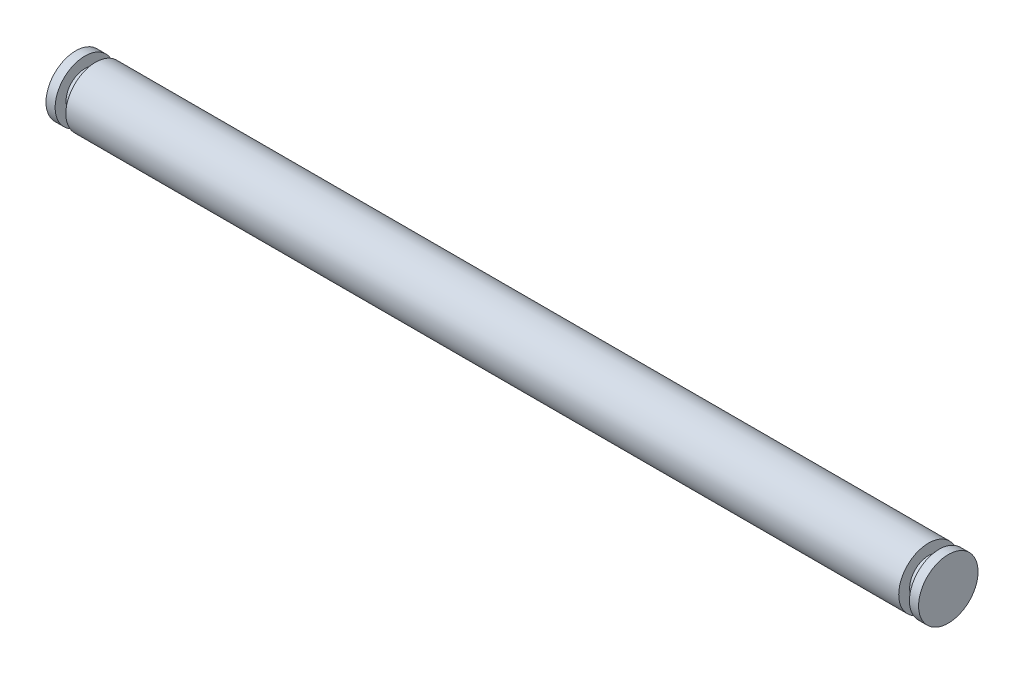
ISO-10303-21;
HEADER;
FILE_DESCRIPTION(('STEP AP214'),'2;1');
FILE_NAME('part.step','',(''),(''),'','','');
FILE_SCHEMA(('AUTOMOTIVE_DESIGN { 1 0 10303 214 1 1 1 1 }'));
ENDSEC;
DATA;
#1=APPLICATION_CONTEXT('core data for automotive mechanical design processes');
#2=APPLICATION_PROTOCOL_DEFINITION('international standard','automotive_design',2000,#1);
#3=PRODUCT_CONTEXT('',#1,'mechanical');
#4=PRODUCT('Part','Part','',(#3));
#5=PRODUCT_RELATED_PRODUCT_CATEGORY('part','',(#4));
#6=PRODUCT_DEFINITION_FORMATION('','',#4);
#7=PRODUCT_DEFINITION_CONTEXT('part definition',#1,'design');
#8=PRODUCT_DEFINITION('design','',#6,#7);
#9=PRODUCT_DEFINITION_SHAPE('','',#8);
#10=(LENGTH_UNIT() NAMED_UNIT(*) SI_UNIT(.MILLI.,.METRE.));
#11=(NAMED_UNIT(*) PLANE_ANGLE_UNIT() SI_UNIT($,.RADIAN.));
#12=(NAMED_UNIT(*) SI_UNIT($,.STERADIAN.) SOLID_ANGLE_UNIT());
#13=UNCERTAINTY_MEASURE_WITH_UNIT(LENGTH_MEASURE(1.E-05),#10,'distance_accuracy_value','');
#14=(GEOMETRIC_REPRESENTATION_CONTEXT(3) GLOBAL_UNCERTAINTY_ASSIGNED_CONTEXT((#13)) GLOBAL_UNIT_ASSIGNED_CONTEXT((#10,
#11,#12)) REPRESENTATION_CONTEXT('',''));
#15=CARTESIAN_POINT('',(0.,0.,0.));
#16=DIRECTION('',(0.,0.,1.));
#17=DIRECTION('',(1.,0.,0.));
#18=AXIS2_PLACEMENT_3D('',#15,#16,#17);
#19=CARTESIAN_POINT('',(22.,0.,0.));
#20=DIRECTION('',(-1.,0.,0.));
#21=DIRECTION('',(0.,0.,1.));
#22=AXIS2_PLACEMENT_3D('',#19,#20,#21);
#23=CYLINDRICAL_SURFACE('',#22,1.5);
#24=CARTESIAN_POINT('',(22.,0.,0.));
#25=DIRECTION('',(-1.,0.,0.));
#26=DIRECTION('',(0.,0.,1.));
#27=AXIS2_PLACEMENT_3D('',#24,#25,#26);
#28=CIRCLE('',#27,1.5);
#29=CARTESIAN_POINT('',(22.,0.,1.5));
#30=VERTEX_POINT('',#29);
#31=EDGE_CURVE('E10',#30,#30,#28,.T.);
#32=ORIENTED_EDGE('',*,*,#31,.T.);
#33=EDGE_LOOP('',(#32));
#34=FACE_BOUND('',#33,.T.);
#35=CARTESIAN_POINT('',(21.54,0.,0.));
#36=DIRECTION('',(-1.,0.,0.));
#37=DIRECTION('',(0.,0.,1.));
#38=AXIS2_PLACEMENT_3D('',#35,#36,#37);
#39=CIRCLE('',#38,1.5);
#40=CARTESIAN_POINT('',(21.54,0.,1.5));
#41=VERTEX_POINT('',#40);
#42=EDGE_CURVE('E69',#41,#41,#39,.T.);
#43=ORIENTED_EDGE('',*,*,#42,.F.);
#44=EDGE_LOOP('',(#43));
#45=FACE_BOUND('',#44,.T.);
#46=ADVANCED_FACE('F35',(#34,#45),#23,.T.);
#47=CARTESIAN_POINT('',(22.,1.5,0.));
#48=DIRECTION('',(1.,0.,0.));
#49=DIRECTION('',(0.,0.,-1.));
#50=AXIS2_PLACEMENT_3D('',#47,#48,#49);
#51=PLANE('',#50);
#52=ORIENTED_EDGE('',*,*,#31,.F.);
#53=EDGE_LOOP('',(#52));
#54=FACE_BOUND('',#53,.T.);
#55=ADVANCED_FACE('F77',(#54),#51,.T.);
#56=CARTESIAN_POINT('',(-22.,0.,0.));
#57=DIRECTION('',(-1.,0.,0.));
#58=DIRECTION('',(0.,0.,1.));
#59=AXIS2_PLACEMENT_3D('',#56,#57,#58);
#60=PLANE('',#59);
#61=CARTESIAN_POINT('',(-22.,0.,0.));
#62=DIRECTION('',(-1.,0.,0.));
#63=DIRECTION('',(0.,0.,1.));
#64=AXIS2_PLACEMENT_3D('',#61,#62,#63);
#65=CIRCLE('',#64,1.5);
#66=CARTESIAN_POINT('',(-22.,0.,1.5));
#67=VERTEX_POINT('',#66);
#68=EDGE_CURVE('E41',#67,#67,#65,.T.);
#69=ORIENTED_EDGE('',*,*,#68,.T.);
#70=EDGE_LOOP('',(#69));
#71=FACE_BOUND('',#70,.T.);
#72=ADVANCED_FACE('F81',(#71),#60,.T.);
#73=CARTESIAN_POINT('',(22.,0.,0.));
#74=DIRECTION('',(-1.,0.,0.));
#75=DIRECTION('',(0.,0.,1.));
#76=AXIS2_PLACEMENT_3D('',#73,#74,#75);
#77=CYLINDRICAL_SURFACE('',#76,1.5);
#78=CARTESIAN_POINT('',(-21.54,0.,0.));
#79=DIRECTION('',(-1.,0.,0.));
#80=DIRECTION('',(0.,0.,1.));
#81=AXIS2_PLACEMENT_3D('',#78,#79,#80);
#82=CIRCLE('',#81,1.5);
#83=CARTESIAN_POINT('',(-21.54,0.,1.5));
#84=VERTEX_POINT('',#83);
#85=EDGE_CURVE('E45',#84,#84,#82,.T.);
#86=ORIENTED_EDGE('',*,*,#85,.T.);
#87=EDGE_LOOP('',(#86));
#88=FACE_BOUND('',#87,.T.);
#89=ORIENTED_EDGE('',*,*,#68,.F.);
#90=EDGE_LOOP('',(#89));
#91=FACE_BOUND('',#90,.T.);
#92=ADVANCED_FACE('F86',(#88,#91),#77,.T.);
#93=CARTESIAN_POINT('',(-21.54,1.5,0.));
#94=DIRECTION('',(1.,0.,0.));
#95=DIRECTION('',(0.,0.,-1.));
#96=AXIS2_PLACEMENT_3D('',#93,#94,#95);
#97=PLANE('',#96);
#98=CARTESIAN_POINT('',(-21.54,0.,0.));
#99=DIRECTION('',(-1.,0.,0.));
#100=DIRECTION('',(0.,0.,1.));
#101=AXIS2_PLACEMENT_3D('',#98,#99,#100);
#102=CIRCLE('',#101,0.95);
#103=CARTESIAN_POINT('',(-21.54,0.,0.95));
#104=VERTEX_POINT('',#103);
#105=EDGE_CURVE('E49',#104,#104,#102,.T.);
#106=ORIENTED_EDGE('',*,*,#105,.T.);
#107=EDGE_LOOP('',(#106));
#108=FACE_BOUND('',#107,.T.);
#109=ORIENTED_EDGE('',*,*,#85,.F.);
#110=EDGE_LOOP('',(#109));
#111=FACE_BOUND('',#110,.T.);
#112=ADVANCED_FACE('F91',(#108,#111),#97,.T.);
#113=CARTESIAN_POINT('',(22.,0.,0.));
#114=DIRECTION('',(-1.,0.,0.));
#115=DIRECTION('',(0.,0.,1.));
#116=AXIS2_PLACEMENT_3D('',#113,#114,#115);
#117=CYLINDRICAL_SURFACE('',#116,0.95);
#118=CARTESIAN_POINT('',(-21.,0.,0.));
#119=DIRECTION('',(-1.,0.,0.));
#120=DIRECTION('',(0.,0.,1.));
#121=AXIS2_PLACEMENT_3D('',#118,#119,#120);
#122=CIRCLE('',#121,0.95);
#123=CARTESIAN_POINT('',(-21.,0.,0.95));
#124=VERTEX_POINT('',#123);
#125=EDGE_CURVE('E54',#124,#124,#122,.T.);
#126=ORIENTED_EDGE('',*,*,#125,.T.);
#127=EDGE_LOOP('',(#126));
#128=FACE_BOUND('',#127,.T.);
#129=ORIENTED_EDGE('',*,*,#105,.F.);
#130=EDGE_LOOP('',(#129));
#131=FACE_BOUND('',#130,.T.);
#132=ADVANCED_FACE('F95',(#128,#131),#117,.T.);
#133=CARTESIAN_POINT('',(-21.,0.95,0.));
#134=DIRECTION('',(-1.,0.,0.));
#135=DIRECTION('',(0.,0.,1.));
#136=AXIS2_PLACEMENT_3D('',#133,#134,#135);
#137=PLANE('',#136);
#138=CARTESIAN_POINT('',(-21.,0.,0.));
#139=DIRECTION('',(-1.,0.,0.));
#140=DIRECTION('',(0.,0.,1.));
#141=AXIS2_PLACEMENT_3D('',#138,#139,#140);
#142=CIRCLE('',#141,1.5);
#143=CARTESIAN_POINT('',(-21.,0.,1.5));
#144=VERTEX_POINT('',#143);
#145=EDGE_CURVE('E57',#144,#144,#142,.T.);
#146=ORIENTED_EDGE('',*,*,#145,.T.);
#147=EDGE_LOOP('',(#146));
#148=FACE_BOUND('',#147,.T.);
#149=ORIENTED_EDGE('',*,*,#125,.F.);
#150=EDGE_LOOP('',(#149));
#151=FACE_BOUND('',#150,.T.);
#152=ADVANCED_FACE('F99',(#148,#151),#137,.T.);
#153=CARTESIAN_POINT('',(22.,0.,0.));
#154=DIRECTION('',(-1.,0.,0.));
#155=DIRECTION('',(0.,0.,1.));
#156=AXIS2_PLACEMENT_3D('',#153,#154,#155);
#157=CYLINDRICAL_SURFACE('',#156,1.5);
#158=CARTESIAN_POINT('',(21.,0.,0.));
#159=DIRECTION('',(-1.,0.,0.));
#160=DIRECTION('',(0.,0.,1.));
#161=AXIS2_PLACEMENT_3D('',#158,#159,#160);
#162=CIRCLE('',#161,1.5);
#163=CARTESIAN_POINT('',(21.,0.,1.5));
#164=VERTEX_POINT('',#163);
#165=EDGE_CURVE('E60',#164,#164,#162,.T.);
#166=ORIENTED_EDGE('',*,*,#165,.T.);
#167=EDGE_LOOP('',(#166));
#168=FACE_BOUND('',#167,.T.);
#169=ORIENTED_EDGE('',*,*,#145,.F.);
#170=EDGE_LOOP('',(#169));
#171=FACE_BOUND('',#170,.T.);
#172=ADVANCED_FACE('F103',(#168,#171),#157,.T.);
#173=CARTESIAN_POINT('',(21.,1.5,0.));
#174=DIRECTION('',(1.,0.,0.));
#175=DIRECTION('',(0.,0.,-1.));
#176=AXIS2_PLACEMENT_3D('',#173,#174,#175);
#177=PLANE('',#176);
#178=CARTESIAN_POINT('',(21.,0.,0.));
#179=DIRECTION('',(-1.,0.,0.));
#180=DIRECTION('',(0.,0.,1.));
#181=AXIS2_PLACEMENT_3D('',#178,#179,#180);
#182=CIRCLE('',#181,0.95);
#183=CARTESIAN_POINT('',(21.,0.,0.95));
#184=VERTEX_POINT('',#183);
#185=EDGE_CURVE('E63',#184,#184,#182,.T.);
#186=ORIENTED_EDGE('',*,*,#185,.T.);
#187=EDGE_LOOP('',(#186));
#188=FACE_BOUND('',#187,.T.);
#189=ORIENTED_EDGE('',*,*,#165,.F.);
#190=EDGE_LOOP('',(#189));
#191=FACE_BOUND('',#190,.T.);
#192=ADVANCED_FACE('F107',(#188,#191),#177,.T.);
#193=CARTESIAN_POINT('',(22.,0.,0.));
#194=DIRECTION('',(-1.,0.,0.));
#195=DIRECTION('',(0.,0.,1.));
#196=AXIS2_PLACEMENT_3D('',#193,#194,#195);
#197=CYLINDRICAL_SURFACE('',#196,0.95);
#198=CARTESIAN_POINT('',(21.54,0.,0.));
#199=DIRECTION('',(-1.,0.,0.));
#200=DIRECTION('',(0.,0.,1.));
#201=AXIS2_PLACEMENT_3D('',#198,#199,#200);
#202=CIRCLE('',#201,0.95);
#203=CARTESIAN_POINT('',(21.54,0.,0.95));
#204=VERTEX_POINT('',#203);
#205=EDGE_CURVE('E66',#204,#204,#202,.T.);
#206=ORIENTED_EDGE('',*,*,#205,.T.);
#207=EDGE_LOOP('',(#206));
#208=FACE_BOUND('',#207,.T.);
#209=ORIENTED_EDGE('',*,*,#185,.F.);
#210=EDGE_LOOP('',(#209));
#211=FACE_BOUND('',#210,.T.);
#212=ADVANCED_FACE('F111',(#208,#211),#197,.T.);
#213=CARTESIAN_POINT('',(21.54,0.95,0.));
#214=DIRECTION('',(-1.,0.,0.));
#215=DIRECTION('',(0.,0.,1.));
#216=AXIS2_PLACEMENT_3D('',#213,#214,#215);
#217=PLANE('',#216);
#218=ORIENTED_EDGE('',*,*,#42,.T.);
#219=EDGE_LOOP('',(#218));
#220=FACE_BOUND('',#219,.T.);
#221=ORIENTED_EDGE('',*,*,#205,.F.);
#222=EDGE_LOOP('',(#221));
#223=FACE_BOUND('',#222,.T.);
#224=ADVANCED_FACE('F73',(#220,#223),#217,.T.);
#225=CLOSED_SHELL('',(#46,#55,#72,#92,#112,#132,#152,#172,#192,#212,#224));
#226=MANIFOLD_SOLID_BREP('B2',#225);
#227=ADVANCED_BREP_SHAPE_REPRESENTATION('',(#18,#226),#14);
#228=SHAPE_DEFINITION_REPRESENTATION(#9,#227);
ENDSEC;
END-ISO-10303-21;
